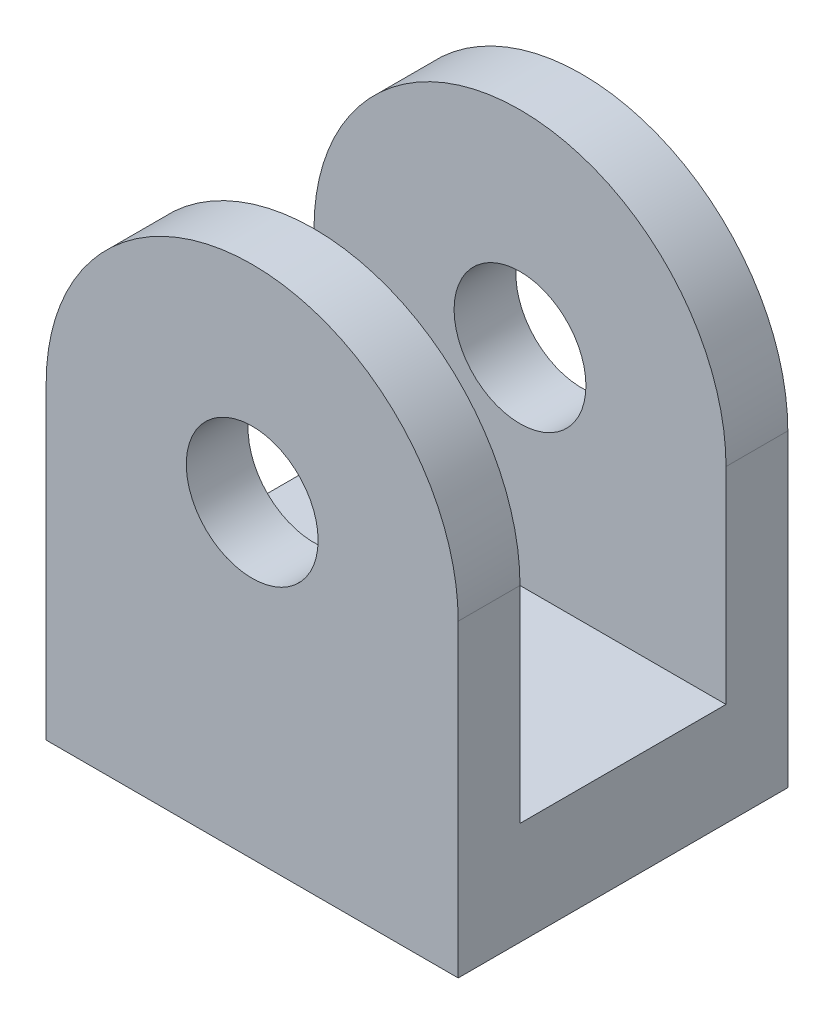
ISO-10303-21;
HEADER;
FILE_DESCRIPTION(('STEP AP214'),'2;1');
FILE_NAME('part.step','',(''),(''),'','','');
FILE_SCHEMA(('AUTOMOTIVE_DESIGN { 1 0 10303 214 1 1 1 1 }'));
ENDSEC;
DATA;
#1=APPLICATION_CONTEXT('core data for automotive mechanical design processes');
#2=APPLICATION_PROTOCOL_DEFINITION('international standard','automotive_design',2000,#1);
#3=PRODUCT_CONTEXT('',#1,'mechanical');
#4=PRODUCT('Part','Part','',(#3));
#5=PRODUCT_RELATED_PRODUCT_CATEGORY('part','',(#4));
#6=PRODUCT_DEFINITION_FORMATION('','',#4);
#7=PRODUCT_DEFINITION_CONTEXT('part definition',#1,'design');
#8=PRODUCT_DEFINITION('design','',#6,#7);
#9=PRODUCT_DEFINITION_SHAPE('','',#8);
#10=(LENGTH_UNIT() NAMED_UNIT(*) SI_UNIT(.MILLI.,.METRE.));
#11=(NAMED_UNIT(*) PLANE_ANGLE_UNIT() SI_UNIT($,.RADIAN.));
#12=(NAMED_UNIT(*) SI_UNIT($,.STERADIAN.) SOLID_ANGLE_UNIT());
#13=UNCERTAINTY_MEASURE_WITH_UNIT(LENGTH_MEASURE(1.E-05),#10,'distance_accuracy_value','');
#14=(GEOMETRIC_REPRESENTATION_CONTEXT(3) GLOBAL_UNCERTAINTY_ASSIGNED_CONTEXT((#13)) GLOBAL_UNIT_ASSIGNED_CONTEXT((#10,
#11,#12)) REPRESENTATION_CONTEXT('',''));
#15=CARTESIAN_POINT('',(0.,0.,0.));
#16=DIRECTION('',(0.,0.,1.));
#17=DIRECTION('',(1.,0.,0.));
#18=AXIS2_PLACEMENT_3D('',#15,#16,#17);
#19=CARTESIAN_POINT('',(0.,12.5,0.));
#20=DIRECTION('',(0.,0.,-1.));
#21=DIRECTION('',(-1.,0.,0.));
#22=AXIS2_PLACEMENT_3D('',#19,#20,#21);
#23=PLANE('',#22);
#24=CARTESIAN_POINT('',(5.,7.5,0.));
#25=DIRECTION('',(0.,0.,1.));
#26=DIRECTION('',(1.,0.,0.));
#27=AXIS2_PLACEMENT_3D('',#24,#25,#26);
#28=CIRCLE('',#27,1.6);
#29=CARTESIAN_POINT('',(6.6,7.5,0.));
#30=VERTEX_POINT('',#29);
#31=EDGE_CURVE('E141',#30,#30,#28,.T.);
#32=ORIENTED_EDGE('',*,*,#31,.F.);
#33=EDGE_LOOP('',(#32));
#34=FACE_BOUND('',#33,.T.);
#35=CARTESIAN_POINT('',(5.,7.5,0.));
#36=DIRECTION('',(0.,0.,1.));
#37=DIRECTION('',(1.,0.,0.));
#38=AXIS2_PLACEMENT_3D('',#35,#36,#37);
#39=CIRCLE('',#38,5.);
#40=CARTESIAN_POINT('',(10.,7.5,0.));
#41=VERTEX_POINT('',#40);
#42=CARTESIAN_POINT('',(0.,7.5,0.));
#43=VERTEX_POINT('',#42);
#44=EDGE_CURVE('E109',#41,#43,#39,.T.);
#45=ORIENTED_EDGE('',*,*,#44,.T.);
#46=DIRECTION('',(0.,-1.,0.));
#47=VECTOR('',#46,1.);
#48=CARTESIAN_POINT('',(0.,12.5,0.));
#49=LINE('',#48,#47);
#50=CARTESIAN_POINT('',(0.,0.,0.));
#51=VERTEX_POINT('',#50);
#52=EDGE_CURVE('E42',#43,#51,#49,.T.);
#53=ORIENTED_EDGE('',*,*,#52,.T.);
#54=DIRECTION('',(1.,0.,0.));
#55=VECTOR('',#54,1.);
#56=CARTESIAN_POINT('',(0.,0.,0.));
#57=LINE('',#56,#55);
#58=CARTESIAN_POINT('',(10.,0.,0.));
#59=VERTEX_POINT('',#58);
#60=EDGE_CURVE('E125',#51,#59,#57,.T.);
#61=ORIENTED_EDGE('',*,*,#60,.T.);
#62=DIRECTION('',(0.,-1.,0.));
#63=VECTOR('',#62,1.);
#64=CARTESIAN_POINT('',(10.,12.5,0.));
#65=LINE('',#64,#63);
#66=EDGE_CURVE('E56',#41,#59,#65,.T.);
#67=ORIENTED_EDGE('',*,*,#66,.F.);
#68=EDGE_LOOP('',(#45,#53,#61,#67));
#69=FACE_BOUND('',#68,.T.);
#70=ADVANCED_FACE('F34',(#34,#69),#23,.F.);
#71=CARTESIAN_POINT('',(0.,12.5,-8.));
#72=DIRECTION('',(0.,0.,-1.));
#73=DIRECTION('',(-1.,0.,0.));
#74=AXIS2_PLACEMENT_3D('',#71,#72,#73);
#75=PLANE('',#74);
#76=CARTESIAN_POINT('',(5.,7.5,-8.));
#77=DIRECTION('',(0.,0.,1.));
#78=DIRECTION('',(1.,0.,0.));
#79=AXIS2_PLACEMENT_3D('',#76,#77,#78);
#80=CIRCLE('',#79,1.6);
#81=CARTESIAN_POINT('',(6.6,7.5,-8.));
#82=VERTEX_POINT('',#81);
#83=EDGE_CURVE('E134',#82,#82,#80,.T.);
#84=ORIENTED_EDGE('',*,*,#83,.T.);
#85=EDGE_LOOP('',(#84));
#86=FACE_BOUND('',#85,.T.);
#87=DIRECTION('',(0.,-1.,0.));
#88=VECTOR('',#87,1.);
#89=CARTESIAN_POINT('',(0.,12.5,-8.));
#90=LINE('',#89,#88);
#91=CARTESIAN_POINT('',(0.,7.5,-8.));
#92=VERTEX_POINT('',#91);
#93=CARTESIAN_POINT('',(0.,0.,-8.));
#94=VERTEX_POINT('',#93);
#95=EDGE_CURVE('E114',#92,#94,#90,.T.);
#96=ORIENTED_EDGE('',*,*,#95,.F.);
#97=CARTESIAN_POINT('',(5.,7.5,-8.));
#98=DIRECTION('',(0.,0.,1.));
#99=DIRECTION('',(1.,0.,0.));
#100=AXIS2_PLACEMENT_3D('',#97,#98,#99);
#101=CIRCLE('',#100,5.);
#102=CARTESIAN_POINT('',(10.,7.5,-8.));
#103=VERTEX_POINT('',#102);
#104=EDGE_CURVE('E98',#103,#92,#101,.T.);
#105=ORIENTED_EDGE('',*,*,#104,.F.);
#106=DIRECTION('',(0.,-1.,0.));
#107=VECTOR('',#106,1.);
#108=CARTESIAN_POINT('',(10.,12.5,-8.));
#109=LINE('',#108,#107);
#110=CARTESIAN_POINT('',(10.,0.,-8.));
#111=VERTEX_POINT('',#110);
#112=EDGE_CURVE('E124',#103,#111,#109,.T.);
#113=ORIENTED_EDGE('',*,*,#112,.T.);
#114=DIRECTION('',(1.,0.,0.));
#115=VECTOR('',#114,1.);
#116=CARTESIAN_POINT('',(0.,0.,-8.));
#117=LINE('',#116,#115);
#118=EDGE_CURVE('E122',#94,#111,#117,.T.);
#119=ORIENTED_EDGE('',*,*,#118,.F.);
#120=EDGE_LOOP('',(#96,#105,#113,#119));
#121=FACE_BOUND('',#120,.T.);
#122=ADVANCED_FACE('F120',(#86,#121),#75,.T.);
#123=CARTESIAN_POINT('',(0.,2.5,-6.5));
#124=DIRECTION('',(0.,0.,-1.));
#125=DIRECTION('',(-1.,0.,0.));
#126=AXIS2_PLACEMENT_3D('',#123,#124,#125);
#127=PLANE('',#126);
#128=CARTESIAN_POINT('',(5.,7.5,-6.5));
#129=DIRECTION('',(0.,0.,-1.));
#130=DIRECTION('',(-1.,0.,0.));
#131=AXIS2_PLACEMENT_3D('',#128,#129,#130);
#132=CIRCLE('',#131,1.6);
#133=CARTESIAN_POINT('',(3.4,7.5,-6.5));
#134=VERTEX_POINT('',#133);
#135=EDGE_CURVE('E133',#134,#134,#132,.T.);
#136=ORIENTED_EDGE('',*,*,#135,.T.);
#137=EDGE_LOOP('',(#136));
#138=FACE_BOUND('',#137,.T.);
#139=CARTESIAN_POINT('',(5.,7.5,-6.5));
#140=DIRECTION('',(0.,0.,-1.));
#141=DIRECTION('',(-1.,0.,0.));
#142=AXIS2_PLACEMENT_3D('',#139,#140,#141);
#143=CIRCLE('',#142,5.);
#144=CARTESIAN_POINT('',(0.,7.5,-6.5));
#145=VERTEX_POINT('',#144);
#146=CARTESIAN_POINT('',(10.,7.5,-6.5));
#147=VERTEX_POINT('',#146);
#148=EDGE_CURVE('E146',#145,#147,#143,.T.);
#149=ORIENTED_EDGE('',*,*,#148,.F.);
#150=DIRECTION('',(0.,1.,0.));
#151=VECTOR('',#150,1.);
#152=CARTESIAN_POINT('',(0.,2.5,-6.5));
#153=LINE('',#152,#151);
#154=CARTESIAN_POINT('',(0.,2.5,-6.5));
#155=VERTEX_POINT('',#154);
#156=EDGE_CURVE('E117',#155,#145,#153,.T.);
#157=ORIENTED_EDGE('',*,*,#156,.F.);
#158=DIRECTION('',(-1.,0.,0.));
#159=VECTOR('',#158,1.);
#160=CARTESIAN_POINT('',(0.,2.5,-6.5));
#161=LINE('',#160,#159);
#162=CARTESIAN_POINT('',(10.,2.5,-6.5));
#163=VERTEX_POINT('',#162);
#164=EDGE_CURVE('E157',#163,#155,#161,.T.);
#165=ORIENTED_EDGE('',*,*,#164,.F.);
#166=DIRECTION('',(0.,1.,0.));
#167=VECTOR('',#166,1.);
#168=CARTESIAN_POINT('',(10.,2.5,-6.5));
#169=LINE('',#168,#167);
#170=EDGE_CURVE('E163',#163,#147,#169,.T.);
#171=ORIENTED_EDGE('',*,*,#170,.T.);
#172=EDGE_LOOP('',(#149,#157,#165,#171));
#173=FACE_BOUND('',#172,.T.);
#174=ADVANCED_FACE('F191',(#138,#173),#127,.F.);
#175=CARTESIAN_POINT('',(0.,2.5,-1.5));
#176=DIRECTION('',(0.,0.,1.));
#177=DIRECTION('',(1.,0.,0.));
#178=AXIS2_PLACEMENT_3D('',#175,#176,#177);
#179=PLANE('',#178);
#180=CARTESIAN_POINT('',(5.,7.5,-1.5));
#181=DIRECTION('',(0.,0.,1.));
#182=DIRECTION('',(1.,0.,0.));
#183=AXIS2_PLACEMENT_3D('',#180,#181,#182);
#184=CIRCLE('',#183,1.6);
#185=CARTESIAN_POINT('',(6.6,7.5,-1.5));
#186=VERTEX_POINT('',#185);
#187=EDGE_CURVE('E131',#186,#186,#184,.T.);
#188=ORIENTED_EDGE('',*,*,#187,.T.);
#189=EDGE_LOOP('',(#188));
#190=FACE_BOUND('',#189,.T.);
#191=CARTESIAN_POINT('',(5.,7.5,-1.5));
#192=DIRECTION('',(0.,0.,1.));
#193=DIRECTION('',(1.,0.,0.));
#194=AXIS2_PLACEMENT_3D('',#191,#192,#193);
#195=CIRCLE('',#194,5.);
#196=CARTESIAN_POINT('',(10.,7.5,-1.5));
#197=VERTEX_POINT('',#196);
#198=CARTESIAN_POINT('',(0.,7.5,-1.5));
#199=VERTEX_POINT('',#198);
#200=EDGE_CURVE('E12',#197,#199,#195,.T.);
#201=ORIENTED_EDGE('',*,*,#200,.F.);
#202=DIRECTION('',(0.,1.,0.));
#203=VECTOR('',#202,1.);
#204=CARTESIAN_POINT('',(10.,2.5,-1.5));
#205=LINE('',#204,#203);
#206=CARTESIAN_POINT('',(10.,2.5,-1.5));
#207=VERTEX_POINT('',#206);
#208=EDGE_CURVE('E166',#207,#197,#205,.T.);
#209=ORIENTED_EDGE('',*,*,#208,.F.);
#210=DIRECTION('',(1.,0.,0.));
#211=VECTOR('',#210,1.);
#212=CARTESIAN_POINT('',(0.,2.5,-1.5));
#213=LINE('',#212,#211);
#214=CARTESIAN_POINT('',(0.,2.5,-1.5));
#215=VERTEX_POINT('',#214);
#216=EDGE_CURVE('E152',#215,#207,#213,.T.);
#217=ORIENTED_EDGE('',*,*,#216,.F.);
#218=DIRECTION('',(0.,1.,0.));
#219=VECTOR('',#218,1.);
#220=CARTESIAN_POINT('',(0.,2.5,-1.5));
#221=LINE('',#220,#219);
#222=EDGE_CURVE('E160',#215,#199,#221,.T.);
#223=ORIENTED_EDGE('',*,*,#222,.T.);
#224=EDGE_LOOP('',(#201,#209,#217,#223));
#225=FACE_BOUND('',#224,.T.);
#226=ADVANCED_FACE('F183',(#190,#225),#179,.F.);
#227=CARTESIAN_POINT('',(0.,12.5,0.));
#228=DIRECTION('',(-1.,0.,0.));
#229=DIRECTION('',(0.,0.,1.));
#230=AXIS2_PLACEMENT_3D('',#227,#228,#229);
#231=PLANE('',#230);
#232=DIRECTION('',(0.,0.,1.));
#233=VECTOR('',#232,1.);
#234=CARTESIAN_POINT('',(0.,7.5,-8.));
#235=LINE('',#234,#233);
#236=EDGE_CURVE('E101',#92,#145,#235,.T.);
#237=ORIENTED_EDGE('',*,*,#236,.F.);
#238=ORIENTED_EDGE('',*,*,#95,.T.);
#239=DIRECTION('',(0.,0.,-1.));
#240=VECTOR('',#239,1.);
#241=CARTESIAN_POINT('',(0.,0.,0.));
#242=LINE('',#241,#240);
#243=EDGE_CURVE('E162',#51,#94,#242,.T.);
#244=ORIENTED_EDGE('',*,*,#243,.F.);
#245=ORIENTED_EDGE('',*,*,#52,.F.);
#246=EDGE_CURVE('E108',#199,#43,#235,.T.);
#247=ORIENTED_EDGE('',*,*,#246,.F.);
#248=ORIENTED_EDGE('',*,*,#222,.F.);
#249=DIRECTION('',(0.,0.,1.));
#250=VECTOR('',#249,1.);
#251=CARTESIAN_POINT('',(0.,2.5,-6.5));
#252=LINE('',#251,#250);
#253=EDGE_CURVE('E138',#155,#215,#252,.T.);
#254=ORIENTED_EDGE('',*,*,#253,.F.);
#255=ORIENTED_EDGE('',*,*,#156,.T.);
#256=EDGE_LOOP('',(#237,#238,#244,#245,#247,#248,#254,#255));
#257=FACE_BOUND('',#256,.T.);
#258=ADVANCED_FACE('F36',(#257),#231,.T.);
#259=CARTESIAN_POINT('',(10.,12.5,0.));
#260=DIRECTION('',(-1.,0.,0.));
#261=DIRECTION('',(0.,0.,1.));
#262=AXIS2_PLACEMENT_3D('',#259,#260,#261);
#263=PLANE('',#262);
#264=ORIENTED_EDGE('',*,*,#112,.F.);
#265=DIRECTION('',(0.,0.,1.));
#266=VECTOR('',#265,1.);
#267=CARTESIAN_POINT('',(10.,7.5,-8.));
#268=LINE('',#267,#266);
#269=EDGE_CURVE('E104',#103,#147,#268,.T.);
#270=ORIENTED_EDGE('',*,*,#269,.T.);
#271=ORIENTED_EDGE('',*,*,#170,.F.);
#272=DIRECTION('',(0.,0.,-1.));
#273=VECTOR('',#272,1.);
#274=CARTESIAN_POINT('',(10.,2.5,-6.5));
#275=LINE('',#274,#273);
#276=EDGE_CURVE('E155',#207,#163,#275,.T.);
#277=ORIENTED_EDGE('',*,*,#276,.F.);
#278=ORIENTED_EDGE('',*,*,#208,.T.);
#279=EDGE_CURVE('E118',#197,#41,#268,.T.);
#280=ORIENTED_EDGE('',*,*,#279,.T.);
#281=ORIENTED_EDGE('',*,*,#66,.T.);
#282=DIRECTION('',(0.,0.,-1.));
#283=VECTOR('',#282,1.);
#284=CARTESIAN_POINT('',(10.,0.,0.));
#285=LINE('',#284,#283);
#286=EDGE_CURVE('E128',#59,#111,#285,.T.);
#287=ORIENTED_EDGE('',*,*,#286,.T.);
#288=EDGE_LOOP('',(#264,#270,#271,#277,#278,#280,#281,#287));
#289=FACE_BOUND('',#288,.T.);
#290=ADVANCED_FACE('F175',(#289),#263,.F.);
#291=CARTESIAN_POINT('',(0.,0.,0.));
#292=DIRECTION('',(0.,-1.,0.));
#293=DIRECTION('',(0.,0.,-1.));
#294=AXIS2_PLACEMENT_3D('',#291,#292,#293);
#295=PLANE('',#294);
#296=ORIENTED_EDGE('',*,*,#243,.T.);
#297=ORIENTED_EDGE('',*,*,#118,.T.);
#298=ORIENTED_EDGE('',*,*,#286,.F.);
#299=ORIENTED_EDGE('',*,*,#60,.F.);
#300=EDGE_LOOP('',(#296,#297,#298,#299));
#301=FACE_BOUND('',#300,.T.);
#302=ADVANCED_FACE('F177',(#301),#295,.T.);
#303=CARTESIAN_POINT('',(0.,2.5,0.));
#304=DIRECTION('',(0.,1.,0.));
#305=DIRECTION('',(0.,0.,1.));
#306=AXIS2_PLACEMENT_3D('',#303,#304,#305);
#307=PLANE('',#306);
#308=ORIENTED_EDGE('',*,*,#253,.T.);
#309=ORIENTED_EDGE('',*,*,#216,.T.);
#310=ORIENTED_EDGE('',*,*,#276,.T.);
#311=ORIENTED_EDGE('',*,*,#164,.T.);
#312=EDGE_LOOP('',(#308,#309,#310,#311));
#313=FACE_BOUND('',#312,.T.);
#314=ADVANCED_FACE('F187',(#313),#307,.T.);
#315=CARTESIAN_POINT('',(5.,7.5,-8.));
#316=DIRECTION('',(0.,0.,1.));
#317=DIRECTION('',(1.,0.,0.));
#318=AXIS2_PLACEMENT_3D('',#315,#316,#317);
#319=CYLINDRICAL_SURFACE('',#318,1.6);
#320=ORIENTED_EDGE('',*,*,#31,.T.);
#321=EDGE_LOOP('',(#320));
#322=FACE_BOUND('',#321,.T.);
#323=ORIENTED_EDGE('',*,*,#187,.F.);
#324=EDGE_LOOP('',(#323));
#325=FACE_BOUND('',#324,.T.);
#326=ADVANCED_FACE('F202',(#322,#325),#319,.F.);
#327=ORIENTED_EDGE('',*,*,#83,.F.);
#328=EDGE_LOOP('',(#327));
#329=FACE_BOUND('',#328,.T.);
#330=ORIENTED_EDGE('',*,*,#135,.F.);
#331=EDGE_LOOP('',(#330));
#332=FACE_BOUND('',#331,.T.);
#333=ADVANCED_FACE('F196',(#329,#332),#319,.F.);
#334=CARTESIAN_POINT('',(5.,7.5,-8.));
#335=DIRECTION('',(0.,0.,1.));
#336=DIRECTION('',(1.,0.,0.));
#337=AXIS2_PLACEMENT_3D('',#334,#335,#336);
#338=CYLINDRICAL_SURFACE('',#337,5.);
#339=ORIENTED_EDGE('',*,*,#279,.F.);
#340=ORIENTED_EDGE('',*,*,#200,.T.);
#341=ORIENTED_EDGE('',*,*,#246,.T.);
#342=ORIENTED_EDGE('',*,*,#44,.F.);
#343=EDGE_LOOP('',(#339,#340,#341,#342));
#344=FACE_BOUND('',#343,.T.);
#345=ADVANCED_FACE('F194',(#344),#338,.T.);
#346=ORIENTED_EDGE('',*,*,#104,.T.);
#347=ORIENTED_EDGE('',*,*,#236,.T.);
#348=ORIENTED_EDGE('',*,*,#148,.T.);
#349=ORIENTED_EDGE('',*,*,#269,.F.);
#350=EDGE_LOOP('',(#346,#347,#348,#349));
#351=FACE_BOUND('',#350,.T.);
#352=ADVANCED_FACE('F100',(#351),#338,.T.);
#353=CLOSED_SHELL('',(#70,#122,#174,#226,#258,#290,#302,#314,#326,#333,#345,#352));
#354=MANIFOLD_SOLID_BREP('B2',#353);
#355=ADVANCED_BREP_SHAPE_REPRESENTATION('',(#18,#354),#14);
#356=SHAPE_DEFINITION_REPRESENTATION(#9,#355);
ENDSEC;
END-ISO-10303-21;
